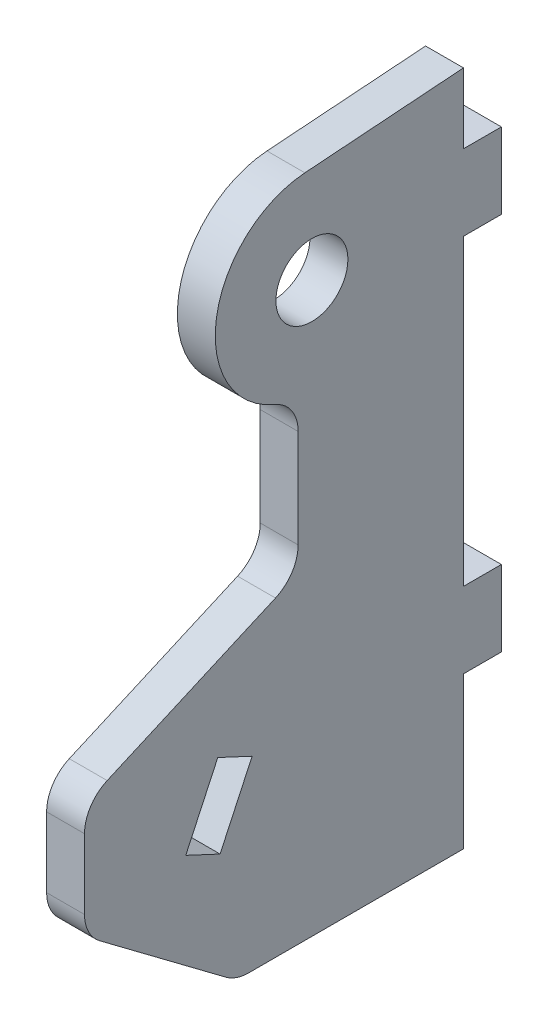
ISO-10303-21;
HEADER;
FILE_DESCRIPTION(('STEP AP214'),'2;1');
FILE_NAME('part.step','',(''),(''),'','','');
FILE_SCHEMA(('AUTOMOTIVE_DESIGN { 1 0 10303 214 1 1 1 1 }'));
ENDSEC;
DATA;
#1=APPLICATION_CONTEXT('core data for automotive mechanical design processes');
#2=APPLICATION_PROTOCOL_DEFINITION('international standard','automotive_design',2000,#1);
#3=PRODUCT_CONTEXT('',#1,'mechanical');
#4=PRODUCT('Part','Part','',(#3));
#5=PRODUCT_RELATED_PRODUCT_CATEGORY('part','',(#4));
#6=PRODUCT_DEFINITION_FORMATION('','',#4);
#7=PRODUCT_DEFINITION_CONTEXT('part definition',#1,'design');
#8=PRODUCT_DEFINITION('design','',#6,#7);
#9=PRODUCT_DEFINITION_SHAPE('','',#8);
#10=(LENGTH_UNIT() NAMED_UNIT(*) SI_UNIT(.MILLI.,.METRE.));
#11=(NAMED_UNIT(*) PLANE_ANGLE_UNIT() SI_UNIT($,.RADIAN.));
#12=(NAMED_UNIT(*) SI_UNIT($,.STERADIAN.) SOLID_ANGLE_UNIT());
#13=UNCERTAINTY_MEASURE_WITH_UNIT(LENGTH_MEASURE(1.E-05),#10,'distance_accuracy_value','');
#14=(GEOMETRIC_REPRESENTATION_CONTEXT(3) GLOBAL_UNCERTAINTY_ASSIGNED_CONTEXT((#13)) GLOBAL_UNIT_ASSIGNED_CONTEXT((#10,
#11,#12)) REPRESENTATION_CONTEXT('',''));
#15=CARTESIAN_POINT('',(0.,0.,0.));
#16=DIRECTION('',(0.,0.,1.));
#17=DIRECTION('',(1.,0.,0.));
#18=AXIS2_PLACEMENT_3D('',#15,#16,#17);
#19=CARTESIAN_POINT('',(2.5,-15.7577175116872,0.));
#20=DIRECTION('',(0.,0.,1.));
#21=DIRECTION('',(1.,0.,0.));
#22=AXIS2_PLACEMENT_3D('',#19,#20,#21);
#23=PLANE('',#22);
#24=DIRECTION('',(-1.,0.,0.));
#25=VECTOR('',#24,1.);
#26=CARTESIAN_POINT('',(0.,-55.,0.));
#27=LINE('',#26,#25);
#28=CARTESIAN_POINT('',(2.5,-55.,0.));
#29=VERTEX_POINT('',#28);
#30=CARTESIAN_POINT('',(-2.5,-55.,0.));
#31=VERTEX_POINT('',#30);
#32=EDGE_CURVE('E66',#29,#31,#27,.T.);
#33=ORIENTED_EDGE('',*,*,#32,.F.);
#34=DIRECTION('',(0.,1.,0.));
#35=VECTOR('',#34,1.);
#36=CARTESIAN_POINT('',(2.5,-74.9977175116872,0.));
#37=LINE('',#36,#35);
#38=CARTESIAN_POINT('',(2.5,-74.9977175116872,0.));
#39=VERTEX_POINT('',#38);
#40=EDGE_CURVE('E308',#39,#29,#37,.T.);
#41=ORIENTED_EDGE('',*,*,#40,.F.);
#42=DIRECTION('',(-1.,0.,0.));
#43=VECTOR('',#42,1.);
#44=CARTESIAN_POINT('',(2.5,-74.9977175116872,0.));
#45=LINE('',#44,#43);
#46=CARTESIAN_POINT('',(-2.5,-74.9977175116872,0.));
#47=VERTEX_POINT('',#46);
#48=EDGE_CURVE('E357',#39,#47,#45,.T.);
#49=ORIENTED_EDGE('',*,*,#48,.T.);
#50=DIRECTION('',(0.,1.,0.));
#51=VECTOR('',#50,1.);
#52=CARTESIAN_POINT('',(-2.5,-15.7577175116872,0.));
#53=LINE('',#52,#51);
#54=EDGE_CURVE('E339',#47,#31,#53,.T.);
#55=ORIENTED_EDGE('',*,*,#54,.T.);
#56=EDGE_LOOP('',(#33,#41,#49,#55));
#57=FACE_BOUND('',#56,.T.);
#58=ADVANCED_FACE('F43',(#57),#23,.F.);
#59=CARTESIAN_POINT('',(2.5,0.,20.));
#60=DIRECTION('',(1.,0.,0.));
#61=DIRECTION('',(0.,0.,-1.));
#62=AXIS2_PLACEMENT_3D('',#59,#60,#61);
#63=PLANE('',#62);
#64=DIRECTION('',(0.,0.422618261740701,0.90630778703665));
#65=VECTOR('',#64,1.);
#66=CARTESIAN_POINT('',(2.5,-50.4661785765039,27.8869086912965));
#67=LINE('',#66,#65);
#68=CARTESIAN_POINT('',(2.5,-50.4661785765039,27.8869086912965));
#69=VERTEX_POINT('',#68);
#70=CARTESIAN_POINT('',(2.5,-48.3530872678004,32.4184476264797));
#71=VERTEX_POINT('',#70);
#72=EDGE_CURVE('E256',#69,#71,#67,.T.);
#73=ORIENTED_EDGE('',*,*,#72,.F.);
#74=DIRECTION('',(0.,-0.90630778703665,0.4226182617407));
#75=VECTOR('',#74,1.);
#76=CARTESIAN_POINT('',(2.5,-50.4661785765039,27.8869086912965));
#77=LINE('',#76,#75);
#78=CARTESIAN_POINT('',(2.5,-59.5292564468704,32.1130913087035));
#79=VERTEX_POINT('',#78);
#80=EDGE_CURVE('E264',#69,#79,#77,.T.);
#81=ORIENTED_EDGE('',*,*,#80,.T.);
#82=DIRECTION('',(0.,0.4226182617407,0.90630778703665));
#83=VECTOR('',#82,1.);
#84=CARTESIAN_POINT('',(2.5,-59.5292564468704,32.1130913087035));
#85=LINE('',#84,#83);
#86=CARTESIAN_POINT('',(2.5,-57.4161651381669,36.6446302438868));
#87=VERTEX_POINT('',#86);
#88=EDGE_CURVE('E261',#79,#87,#85,.T.);
#89=ORIENTED_EDGE('',*,*,#88,.T.);
#90=DIRECTION('',(0.,-0.90630778703665,0.422618261740701));
#91=VECTOR('',#90,1.);
#92=CARTESIAN_POINT('',(2.5,-48.3530872678004,32.4184476264797));
#93=LINE('',#92,#91);
#94=EDGE_CURVE('E258',#71,#87,#93,.T.);
#95=ORIENTED_EDGE('',*,*,#94,.F.);
#96=EDGE_LOOP('',(#73,#81,#89,#95));
#97=FACE_BOUND('',#96,.T.);
#98=DIRECTION('',(0.,-0.6,-0.8));
#99=VECTOR('',#98,1.);
#100=CARTESIAN_POINT('',(2.5,-74.9977175116872,30.));
#101=LINE('',#100,#99);
#102=CARTESIAN_POINT('',(2.5,-61.4977175116872,48.));
#103=VERTEX_POINT('',#102);
#104=CARTESIAN_POINT('',(2.5,-73.9977175116872,31.3333333333333));
#105=VERTEX_POINT('',#104);
#106=EDGE_CURVE('E304',#103,#105,#101,.T.);
#107=ORIENTED_EDGE('',*,*,#106,.T.);
#108=CARTESIAN_POINT('',(2.5,-69.9977175116872,28.3333333333333));
#109=DIRECTION('',(1.,0.,0.));
#110=DIRECTION('',(0.,0.,-1.));
#111=AXIS2_PLACEMENT_3D('',#108,#109,#110);
#112=CIRCLE('',#111,5.);
#113=CARTESIAN_POINT('',(2.5,-74.9977175116872,28.3333333333333));
#114=VERTEX_POINT('',#113);
#115=EDGE_CURVE('E396',#105,#114,#112,.T.);
#116=ORIENTED_EDGE('',*,*,#115,.T.);
#117=DIRECTION('',(0.,0.,-1.));
#118=VECTOR('',#117,1.);
#119=CARTESIAN_POINT('',(2.5,-74.9977175116872,30.));
#120=LINE('',#119,#118);
#121=EDGE_CURVE('E306',#114,#39,#120,.T.);
#122=ORIENTED_EDGE('',*,*,#121,.T.);
#123=ORIENTED_EDGE('',*,*,#40,.T.);
#124=DIRECTION('',(0.,0.,1.));
#125=VECTOR('',#124,1.);
#126=CARTESIAN_POINT('',(2.5,-55.,-5.));
#127=LINE('',#126,#125);
#128=CARTESIAN_POINT('',(2.5,-55.,-5.));
#129=VERTEX_POINT('',#128);
#130=EDGE_CURVE('E220',#129,#29,#127,.T.);
#131=ORIENTED_EDGE('',*,*,#130,.F.);
#132=DIRECTION('',(0.,-1.,0.));
#133=VECTOR('',#132,1.);
#134=CARTESIAN_POINT('',(2.5,0.,-5.));
#135=LINE('',#134,#133);
#136=CARTESIAN_POINT('',(2.5,-45.,-5.));
#137=VERTEX_POINT('',#136);
#138=EDGE_CURVE('E223',#137,#129,#135,.T.);
#139=ORIENTED_EDGE('',*,*,#138,.F.);
#140=DIRECTION('',(0.,0.,1.));
#141=VECTOR('',#140,1.);
#142=CARTESIAN_POINT('',(2.5,-45.,-5.));
#143=LINE('',#142,#141);
#144=CARTESIAN_POINT('',(2.5,-45.,0.));
#145=VERTEX_POINT('',#144);
#146=EDGE_CURVE('E211',#137,#145,#143,.T.);
#147=ORIENTED_EDGE('',*,*,#146,.T.);
#148=CARTESIAN_POINT('',(2.5,-5.,0.));
#149=VERTEX_POINT('',#148);
#150=EDGE_CURVE('E58',#145,#149,#37,.T.);
#151=ORIENTED_EDGE('',*,*,#150,.T.);
#152=DIRECTION('',(0.,0.,-1.));
#153=VECTOR('',#152,1.);
#154=CARTESIAN_POINT('',(2.5,-5.,-5.));
#155=LINE('',#154,#153);
#156=CARTESIAN_POINT('',(2.5,-5.,-5.));
#157=VERTEX_POINT('',#156);
#158=EDGE_CURVE('E310',#149,#157,#155,.T.);
#159=ORIENTED_EDGE('',*,*,#158,.T.);
#160=DIRECTION('',(0.,1.,0.));
#161=VECTOR('',#160,1.);
#162=CARTESIAN_POINT('',(2.5,5.,-5.));
#163=LINE('',#162,#161);
#164=CARTESIAN_POINT('',(2.5,5.,-5.));
#165=VERTEX_POINT('',#164);
#166=EDGE_CURVE('E312',#157,#165,#163,.T.);
#167=ORIENTED_EDGE('',*,*,#166,.T.);
#168=DIRECTION('',(0.,0.,1.));
#169=VECTOR('',#168,1.);
#170=CARTESIAN_POINT('',(2.5,5.,-5.));
#171=LINE('',#170,#169);
#172=CARTESIAN_POINT('',(2.5,5.,0.));
#173=VERTEX_POINT('',#172);
#174=EDGE_CURVE('E314',#165,#173,#171,.T.);
#175=ORIENTED_EDGE('',*,*,#174,.T.);
#176=DIRECTION('',(0.,1.,0.));
#177=VECTOR('',#176,1.);
#178=CARTESIAN_POINT('',(2.5,5.,0.));
#179=LINE('',#178,#177);
#180=CARTESIAN_POINT('',(2.5,14.2422824883128,0.));
#181=VERTEX_POINT('',#180);
#182=EDGE_CURVE('E286',#173,#181,#179,.T.);
#183=ORIENTED_EDGE('',*,*,#182,.T.);
#184=DIRECTION('',(0.,-0.0727282972971378,0.997351790880359));
#185=VECTOR('',#184,1.);
#186=CARTESIAN_POINT('',(2.5,14.2422824883128,0.));
#187=LINE('',#186,#185);
#188=CARTESIAN_POINT('',(2.5,12.7162353337246,20.9272857905385));
#189=VERTEX_POINT('',#188);
#190=EDGE_CURVE('E289',#181,#189,#187,.T.);
#191=ORIENTED_EDGE('',*,*,#190,.T.);
#192=CARTESIAN_POINT('',(2.5,0.,20.));
#193=DIRECTION('',(1.,0.,0.));
#194=DIRECTION('',(0.,0.,-1.));
#195=AXIS2_PLACEMENT_3D('',#192,#193,#194);
#196=CIRCLE('',#195,12.75);
#197=CARTESIAN_POINT('',(2.5,-11.7727645964355,24.8953563462647));
#198=VERTEX_POINT('',#197);
#199=EDGE_CURVE('E292',#189,#198,#196,.T.);
#200=ORIENTED_EDGE('',*,*,#199,.T.);
#201=CARTESIAN_POINT('',(2.5,-16.3895350264103,26.8151039330352));
#202=DIRECTION('',(1.,0.,0.));
#203=DIRECTION('',(0.,0.,-1.));
#204=AXIS2_PLACEMENT_3D('',#201,#202,#203);
#205=CIRCLE('',#204,5.);
#206=CARTESIAN_POINT('',(2.5,-16.3895350264103,21.8151039330352));
#207=VERTEX_POINT('',#206);
#208=EDGE_CURVE('E405',#198,#207,#205,.F.);
#209=ORIENTED_EDGE('',*,*,#208,.T.);
#210=DIRECTION('',(0.,-1.,0.));
#211=VECTOR('',#210,1.);
#212=CARTESIAN_POINT('',(2.5,-32.6201385773802,21.8151039330352));
#213=LINE('',#212,#211);
#214=CARTESIAN_POINT('',(2.5,-29.3550180036596,21.8151039330352));
#215=VERTEX_POINT('',#214);
#216=EDGE_CURVE('E295',#207,#215,#213,.T.);
#217=ORIENTED_EDGE('',*,*,#216,.T.);
#218=CARTESIAN_POINT('',(2.5,-29.3550180036596,26.8151039330352));
#219=DIRECTION('',(1.,0.,0.));
#220=DIRECTION('',(0.,0.,-1.));
#221=AXIS2_PLACEMENT_3D('',#218,#219,#220);
#222=CIRCLE('',#221,5.);
#223=CARTESIAN_POINT('',(2.5,-33.9330155948013,24.8046467572913));
#224=VERTEX_POINT('',#223);
#225=EDGE_CURVE('E11',#215,#224,#222,.F.);
#226=ORIENTED_EDGE('',*,*,#225,.T.);
#227=DIRECTION('',(0.,-0.402091435148774,0.915599518228357));
#228=VECTOR('',#227,1.);
#229=CARTESIAN_POINT('',(2.5,-44.9977175116872,50.));
#230=LINE('',#229,#228);
#231=CARTESIAN_POINT('',(2.5,-43.6848404942661,47.0104571757439));
#232=VERTEX_POINT('',#231);
#233=EDGE_CURVE('E298',#224,#232,#230,.T.);
#234=ORIENTED_EDGE('',*,*,#233,.T.);
#235=CARTESIAN_POINT('',(2.5,-48.2628380854079,45.));
#236=DIRECTION('',(1.,0.,0.));
#237=DIRECTION('',(0.,0.,-1.));
#238=AXIS2_PLACEMENT_3D('',#235,#236,#237);
#239=CIRCLE('',#238,5.);
#240=CARTESIAN_POINT('',(2.5,-48.2628380854079,50.));
#241=VERTEX_POINT('',#240);
#242=EDGE_CURVE('E392',#232,#241,#239,.T.);
#243=ORIENTED_EDGE('',*,*,#242,.T.);
#244=DIRECTION('',(0.,-1.,0.));
#245=VECTOR('',#244,1.);
#246=CARTESIAN_POINT('',(2.5,-59.9977175116872,50.));
#247=LINE('',#246,#245);
#248=CARTESIAN_POINT('',(2.5,-57.4977175116872,50.));
#249=VERTEX_POINT('',#248);
#250=EDGE_CURVE('E301',#241,#249,#247,.T.);
#251=ORIENTED_EDGE('',*,*,#250,.T.);
#252=CARTESIAN_POINT('',(2.5,-57.4977175116872,45.));
#253=DIRECTION('',(1.,0.,0.));
#254=DIRECTION('',(0.,0.,-1.));
#255=AXIS2_PLACEMENT_3D('',#252,#253,#254);
#256=CIRCLE('',#255,5.);
#257=EDGE_CURVE('E394',#249,#103,#256,.T.);
#258=ORIENTED_EDGE('',*,*,#257,.T.);
#259=EDGE_LOOP('',(#107,#116,#122,#123,#131,#139,#147,#151,#159,#167,#175,#183,#191,#200,#209,
#217,#226,#234,#243,#251,#258));
#260=FACE_BOUND('',#259,.T.);
#261=CARTESIAN_POINT('',(2.5,0.,20.));
#262=DIRECTION('',(1.,0.,0.));
#263=DIRECTION('',(0.,0.,-1.));
#264=AXIS2_PLACEMENT_3D('',#261,#262,#263);
#265=CIRCLE('',#264,4.75);
#266=CARTESIAN_POINT('',(2.5,0.,15.25));
#267=VERTEX_POINT('',#266);
#268=EDGE_CURVE('E280',#267,#267,#265,.T.);
#269=ORIENTED_EDGE('',*,*,#268,.F.);
#270=EDGE_LOOP('',(#269));
#271=FACE_BOUND('',#270,.T.);
#272=ADVANCED_FACE('F225',(#97,#260,#271),#63,.T.);
#273=CARTESIAN_POINT('',(-2.5,0.,20.));
#274=DIRECTION('',(1.,0.,0.));
#275=DIRECTION('',(0.,0.,-1.));
#276=AXIS2_PLACEMENT_3D('',#273,#274,#275);
#277=PLANE('',#276);
#278=DIRECTION('',(0.,0.90630778703665,-0.4226182617407));
#279=VECTOR('',#278,1.);
#280=CARTESIAN_POINT('',(-2.5,-50.4661785765039,27.8869086912965));
#281=LINE('',#280,#279);
#282=CARTESIAN_POINT('',(-2.5,-59.5292564468704,32.1130913087035));
#283=VERTEX_POINT('',#282);
#284=CARTESIAN_POINT('',(-2.5,-50.4661785765039,27.8869086912965));
#285=VERTEX_POINT('',#284);
#286=EDGE_CURVE('E250',#283,#285,#281,.T.);
#287=ORIENTED_EDGE('',*,*,#286,.T.);
#288=DIRECTION('',(0.,-0.422618261740701,-0.90630778703665));
#289=VECTOR('',#288,1.);
#290=CARTESIAN_POINT('',(-2.5,-50.4661785765039,27.8869086912965));
#291=LINE('',#290,#289);
#292=CARTESIAN_POINT('',(-2.5,-48.3530872678004,32.4184476264797));
#293=VERTEX_POINT('',#292);
#294=EDGE_CURVE('E253',#293,#285,#291,.T.);
#295=ORIENTED_EDGE('',*,*,#294,.F.);
#296=DIRECTION('',(0.,0.90630778703665,-0.422618261740701));
#297=VECTOR('',#296,1.);
#298=CARTESIAN_POINT('',(-2.5,-48.3530872678004,32.4184476264797));
#299=LINE('',#298,#297);
#300=CARTESIAN_POINT('',(-2.5,-57.4161651381669,36.6446302438868));
#301=VERTEX_POINT('',#300);
#302=EDGE_CURVE('E270',#301,#293,#299,.T.);
#303=ORIENTED_EDGE('',*,*,#302,.F.);
#304=DIRECTION('',(0.,-0.4226182617407,-0.90630778703665));
#305=VECTOR('',#304,1.);
#306=CARTESIAN_POINT('',(-2.5,-59.5292564468704,32.1130913087035));
#307=LINE('',#306,#305);
#308=EDGE_CURVE('E219',#301,#283,#307,.T.);
#309=ORIENTED_EDGE('',*,*,#308,.T.);
#310=EDGE_LOOP('',(#287,#295,#303,#309));
#311=FACE_BOUND('',#310,.T.);
#312=DIRECTION('',(0.,0.,-1.));
#313=VECTOR('',#312,1.);
#314=CARTESIAN_POINT('',(-2.5,-74.9977175116872,30.));
#315=LINE('',#314,#313);
#316=CARTESIAN_POINT('',(-2.5,-74.9977175116872,28.3333333333333));
#317=VERTEX_POINT('',#316);
#318=EDGE_CURVE('E336',#317,#47,#315,.T.);
#319=ORIENTED_EDGE('',*,*,#318,.F.);
#320=CARTESIAN_POINT('',(-2.5,-69.9977175116872,28.3333333333333));
#321=DIRECTION('',(1.,0.,0.));
#322=DIRECTION('',(0.,0.,-1.));
#323=AXIS2_PLACEMENT_3D('',#320,#321,#322);
#324=CIRCLE('',#323,5.);
#325=CARTESIAN_POINT('',(-2.5,-73.9977175116872,31.3333333333333));
#326=VERTEX_POINT('',#325);
#327=EDGE_CURVE('E385',#317,#326,#324,.F.);
#328=ORIENTED_EDGE('',*,*,#327,.T.);
#329=DIRECTION('',(0.,-0.6,-0.8));
#330=VECTOR('',#329,1.);
#331=CARTESIAN_POINT('',(-2.5,-74.9977175116872,30.));
#332=LINE('',#331,#330);
#333=CARTESIAN_POINT('',(-2.5,-61.4977175116872,48.));
#334=VERTEX_POINT('',#333);
#335=EDGE_CURVE('E333',#334,#326,#332,.T.);
#336=ORIENTED_EDGE('',*,*,#335,.F.);
#337=CARTESIAN_POINT('',(-2.5,-57.4977175116872,45.));
#338=DIRECTION('',(1.,0.,0.));
#339=DIRECTION('',(0.,0.,-1.));
#340=AXIS2_PLACEMENT_3D('',#337,#338,#339);
#341=CIRCLE('',#340,5.);
#342=CARTESIAN_POINT('',(-2.5,-57.4977175116872,50.));
#343=VERTEX_POINT('',#342);
#344=EDGE_CURVE('E383',#334,#343,#341,.F.);
#345=ORIENTED_EDGE('',*,*,#344,.T.);
#346=DIRECTION('',(0.,-1.,0.));
#347=VECTOR('',#346,1.);
#348=CARTESIAN_POINT('',(-2.5,-59.9977175116872,50.));
#349=LINE('',#348,#347);
#350=CARTESIAN_POINT('',(-2.5,-48.2628380854079,50.));
#351=VERTEX_POINT('',#350);
#352=EDGE_CURVE('E330',#351,#343,#349,.T.);
#353=ORIENTED_EDGE('',*,*,#352,.F.);
#354=CARTESIAN_POINT('',(-2.5,-48.2628380854079,45.));
#355=DIRECTION('',(1.,0.,0.));
#356=DIRECTION('',(0.,0.,-1.));
#357=AXIS2_PLACEMENT_3D('',#354,#355,#356);
#358=CIRCLE('',#357,5.);
#359=CARTESIAN_POINT('',(-2.5,-43.6848404942661,47.0104571757439));
#360=VERTEX_POINT('',#359);
#361=EDGE_CURVE('E381',#351,#360,#358,.F.);
#362=ORIENTED_EDGE('',*,*,#361,.T.);
#363=DIRECTION('',(0.,-0.402091435148774,0.915599518228357));
#364=VECTOR('',#363,1.);
#365=CARTESIAN_POINT('',(-2.5,-44.9977175116872,50.));
#366=LINE('',#365,#364);
#367=CARTESIAN_POINT('',(-2.5,-33.9330155948013,24.8046467572913));
#368=VERTEX_POINT('',#367);
#369=EDGE_CURVE('E327',#368,#360,#366,.T.);
#370=ORIENTED_EDGE('',*,*,#369,.F.);
#371=CARTESIAN_POINT('',(-2.5,-29.3550180036596,26.8151039330352));
#372=DIRECTION('',(1.,0.,0.));
#373=DIRECTION('',(0.,0.,-1.));
#374=AXIS2_PLACEMENT_3D('',#371,#372,#373);
#375=CIRCLE('',#374,5.);
#376=CARTESIAN_POINT('',(-2.5,-29.3550180036596,21.8151039330352));
#377=VERTEX_POINT('',#376);
#378=EDGE_CURVE('E51',#368,#377,#375,.T.);
#379=ORIENTED_EDGE('',*,*,#378,.T.);
#380=DIRECTION('',(0.,-1.,0.));
#381=VECTOR('',#380,1.);
#382=CARTESIAN_POINT('',(-2.5,-32.6201385773802,21.8151039330352));
#383=LINE('',#382,#381);
#384=CARTESIAN_POINT('',(-2.5,-16.3895350264103,21.8151039330352));
#385=VERTEX_POINT('',#384);
#386=EDGE_CURVE('E324',#385,#377,#383,.T.);
#387=ORIENTED_EDGE('',*,*,#386,.F.);
#388=CARTESIAN_POINT('',(-2.5,-16.3895350264103,26.8151039330352));
#389=DIRECTION('',(1.,0.,0.));
#390=DIRECTION('',(0.,0.,-1.));
#391=AXIS2_PLACEMENT_3D('',#388,#389,#390);
#392=CIRCLE('',#391,5.);
#393=CARTESIAN_POINT('',(-2.5,-11.7727645964355,24.8953563462647));
#394=VERTEX_POINT('',#393);
#395=EDGE_CURVE('E403',#385,#394,#392,.T.);
#396=ORIENTED_EDGE('',*,*,#395,.T.);
#397=CARTESIAN_POINT('',(-2.5,0.,20.));
#398=DIRECTION('',(1.,0.,0.));
#399=DIRECTION('',(0.,0.,-1.));
#400=AXIS2_PLACEMENT_3D('',#397,#398,#399);
#401=CIRCLE('',#400,12.75);
#402=CARTESIAN_POINT('',(-2.5,12.7162353337246,20.9272857905385));
#403=VERTEX_POINT('',#402);
#404=EDGE_CURVE('E321',#403,#394,#401,.T.);
#405=ORIENTED_EDGE('',*,*,#404,.F.);
#406=DIRECTION('',(0.,-0.0727282972971378,0.997351790880359));
#407=VECTOR('',#406,1.);
#408=CARTESIAN_POINT('',(-2.5,14.2422824883128,0.));
#409=LINE('',#408,#407);
#410=CARTESIAN_POINT('',(-2.5,14.2422824883128,0.));
#411=VERTEX_POINT('',#410);
#412=EDGE_CURVE('E319',#411,#403,#409,.T.);
#413=ORIENTED_EDGE('',*,*,#412,.F.);
#414=DIRECTION('',(0.,1.,0.));
#415=VECTOR('',#414,1.);
#416=CARTESIAN_POINT('',(-2.5,5.,0.));
#417=LINE('',#416,#415);
#418=CARTESIAN_POINT('',(-2.5,5.,0.));
#419=VERTEX_POINT('',#418);
#420=EDGE_CURVE('E283',#419,#411,#417,.T.);
#421=ORIENTED_EDGE('',*,*,#420,.F.);
#422=DIRECTION('',(0.,0.,1.));
#423=VECTOR('',#422,1.);
#424=CARTESIAN_POINT('',(-2.5,5.,-5.));
#425=LINE('',#424,#423);
#426=CARTESIAN_POINT('',(-2.5,5.,-5.));
#427=VERTEX_POINT('',#426);
#428=EDGE_CURVE('E290',#427,#419,#425,.T.);
#429=ORIENTED_EDGE('',*,*,#428,.F.);
#430=DIRECTION('',(0.,1.,0.));
#431=VECTOR('',#430,1.);
#432=CARTESIAN_POINT('',(-2.5,5.,-5.));
#433=LINE('',#432,#431);
#434=CARTESIAN_POINT('',(-2.5,-5.,-5.));
#435=VERTEX_POINT('',#434);
#436=EDGE_CURVE('E343',#435,#427,#433,.T.);
#437=ORIENTED_EDGE('',*,*,#436,.F.);
#438=DIRECTION('',(0.,0.,-1.));
#439=VECTOR('',#438,1.);
#440=CARTESIAN_POINT('',(-2.5,-5.,-5.));
#441=LINE('',#440,#439);
#442=CARTESIAN_POINT('',(-2.5,-5.,0.));
#443=VERTEX_POINT('',#442);
#444=EDGE_CURVE('E341',#443,#435,#441,.T.);
#445=ORIENTED_EDGE('',*,*,#444,.F.);
#446=CARTESIAN_POINT('',(-2.5,-45.,0.));
#447=VERTEX_POINT('',#446);
#448=EDGE_CURVE('E338',#447,#443,#53,.T.);
#449=ORIENTED_EDGE('',*,*,#448,.F.);
#450=DIRECTION('',(0.,0.,1.));
#451=VECTOR('',#450,1.);
#452=CARTESIAN_POINT('',(-2.5,-45.,-5.));
#453=LINE('',#452,#451);
#454=CARTESIAN_POINT('',(-2.5,-45.,-5.));
#455=VERTEX_POINT('',#454);
#456=EDGE_CURVE('E241',#455,#447,#453,.T.);
#457=ORIENTED_EDGE('',*,*,#456,.F.);
#458=DIRECTION('',(0.,1.,0.));
#459=VECTOR('',#458,1.);
#460=CARTESIAN_POINT('',(-2.5,0.,-5.));
#461=LINE('',#460,#459);
#462=CARTESIAN_POINT('',(-2.5,-55.,-5.));
#463=VERTEX_POINT('',#462);
#464=EDGE_CURVE('E234',#463,#455,#461,.T.);
#465=ORIENTED_EDGE('',*,*,#464,.F.);
#466=DIRECTION('',(0.,0.,1.));
#467=VECTOR('',#466,1.);
#468=CARTESIAN_POINT('',(-2.5,-55.,-5.));
#469=LINE('',#468,#467);
#470=EDGE_CURVE('E244',#463,#31,#469,.T.);
#471=ORIENTED_EDGE('',*,*,#470,.T.);
#472=ORIENTED_EDGE('',*,*,#54,.F.);
#473=EDGE_LOOP('',(#319,#328,#336,#345,#353,#362,#370,#379,#387,#396,#405,#413,#421,#429,#437,
#445,#449,#457,#465,#471,#472));
#474=FACE_BOUND('',#473,.T.);
#475=CARTESIAN_POINT('',(-2.5,0.,20.));
#476=DIRECTION('',(1.,0.,0.));
#477=DIRECTION('',(0.,0.,-1.));
#478=AXIS2_PLACEMENT_3D('',#475,#476,#477);
#479=CIRCLE('',#478,4.75);
#480=CARTESIAN_POINT('',(-2.5,0.,15.25));
#481=VERTEX_POINT('',#480);
#482=EDGE_CURVE('E279',#481,#481,#479,.T.);
#483=ORIENTED_EDGE('',*,*,#482,.T.);
#484=EDGE_LOOP('',(#483));
#485=FACE_BOUND('',#484,.T.);
#486=ADVANCED_FACE('F410',(#311,#474,#485),#277,.F.);
#487=CARTESIAN_POINT('',(2.5,5.,0.));
#488=DIRECTION('',(0.,0.,1.));
#489=DIRECTION('',(1.,0.,0.));
#490=AXIS2_PLACEMENT_3D('',#487,#488,#489);
#491=PLANE('',#490);
#492=ORIENTED_EDGE('',*,*,#420,.T.);
#493=DIRECTION('',(-1.,0.,0.));
#494=VECTOR('',#493,1.);
#495=CARTESIAN_POINT('',(2.5,14.2422824883128,0.));
#496=LINE('',#495,#494);
#497=EDGE_CURVE('E363',#181,#411,#496,.T.);
#498=ORIENTED_EDGE('',*,*,#497,.F.);
#499=ORIENTED_EDGE('',*,*,#182,.F.);
#500=DIRECTION('',(-1.,0.,0.));
#501=VECTOR('',#500,1.);
#502=CARTESIAN_POINT('',(2.5,5.,0.));
#503=LINE('',#502,#501);
#504=EDGE_CURVE('E316',#173,#419,#503,.T.);
#505=ORIENTED_EDGE('',*,*,#504,.T.);
#506=EDGE_LOOP('',(#492,#498,#499,#505));
#507=FACE_BOUND('',#506,.T.);
#508=ADVANCED_FACE('F479',(#507),#491,.F.);
#509=CARTESIAN_POINT('',(2.5,14.2422824883128,0.));
#510=DIRECTION('',(0.,-0.997351790880359,-0.0727282972971378));
#511=DIRECTION('',(0.,0.0727282972971378,-0.997351790880359));
#512=AXIS2_PLACEMENT_3D('',#509,#510,#511);
#513=PLANE('',#512);
#514=ORIENTED_EDGE('',*,*,#412,.T.);
#515=DIRECTION('',(-1.,0.,0.));
#516=VECTOR('',#515,1.);
#517=CARTESIAN_POINT('',(2.5,12.7162353337246,20.9272857905385));
#518=LINE('',#517,#516);
#519=EDGE_CURVE('E360',#189,#403,#518,.T.);
#520=ORIENTED_EDGE('',*,*,#519,.F.);
#521=ORIENTED_EDGE('',*,*,#190,.F.);
#522=ORIENTED_EDGE('',*,*,#497,.T.);
#523=EDGE_LOOP('',(#514,#520,#521,#522));
#524=FACE_BOUND('',#523,.T.);
#525=ADVANCED_FACE('F511',(#524),#513,.F.);
#526=CARTESIAN_POINT('',(2.5,0.,20.));
#527=DIRECTION('',(-1.,0.,0.));
#528=DIRECTION('',(0.,0.,1.));
#529=AXIS2_PLACEMENT_3D('',#526,#527,#528);
#530=CYLINDRICAL_SURFACE('',#529,12.75);
#531=ORIENTED_EDGE('',*,*,#404,.T.);
#532=DIRECTION('',(-1.,0.,0.));
#533=VECTOR('',#532,1.);
#534=CARTESIAN_POINT('',(2.5,-11.7727645964355,24.8953563462647));
#535=LINE('',#534,#533);
#536=EDGE_CURVE('E371',#394,#198,#535,.F.);
#537=ORIENTED_EDGE('',*,*,#536,.T.);
#538=ORIENTED_EDGE('',*,*,#199,.F.);
#539=ORIENTED_EDGE('',*,*,#519,.T.);
#540=EDGE_LOOP('',(#531,#537,#538,#539));
#541=FACE_BOUND('',#540,.T.);
#542=ADVANCED_FACE('F513',(#541),#530,.T.);
#543=CARTESIAN_POINT('',(2.5,-32.6201385773802,21.8151039330352));
#544=DIRECTION('',(0.,0.,-1.));
#545=DIRECTION('',(-1.,0.,0.));
#546=AXIS2_PLACEMENT_3D('',#543,#544,#545);
#547=PLANE('',#546);
#548=ORIENTED_EDGE('',*,*,#216,.F.);
#549=DIRECTION('',(1.,0.,0.));
#550=VECTOR('',#549,1.);
#551=CARTESIAN_POINT('',(-2.5,-16.3895350264103,21.8151039330352));
#552=LINE('',#551,#550);
#553=EDGE_CURVE('E368',#207,#385,#552,.F.);
#554=ORIENTED_EDGE('',*,*,#553,.T.);
#555=ORIENTED_EDGE('',*,*,#386,.T.);
#556=DIRECTION('',(-1.,0.,0.));
#557=VECTOR('',#556,1.);
#558=CARTESIAN_POINT('',(2.5,-29.3550180036596,21.8151039330352));
#559=LINE('',#558,#557);
#560=EDGE_CURVE('E366',#377,#215,#559,.F.);
#561=ORIENTED_EDGE('',*,*,#560,.T.);
#562=EDGE_LOOP('',(#548,#554,#555,#561));
#563=FACE_BOUND('',#562,.T.);
#564=ADVANCED_FACE('F417',(#563),#547,.F.);
#565=CARTESIAN_POINT('',(2.5,-44.9977175116872,50.));
#566=DIRECTION('',(0.,-0.915599518228357,-0.402091435148774));
#567=DIRECTION('',(0.,0.402091435148774,-0.915599518228357));
#568=AXIS2_PLACEMENT_3D('',#565,#566,#567);
#569=PLANE('',#568);
#570=ORIENTED_EDGE('',*,*,#233,.F.);
#571=DIRECTION('',(-1.,0.,0.));
#572=VECTOR('',#571,1.);
#573=CARTESIAN_POINT('',(-2.5,-33.9330155948013,24.8046467572913));
#574=LINE('',#573,#572);
#575=EDGE_CURVE('E375',#224,#368,#574,.T.);
#576=ORIENTED_EDGE('',*,*,#575,.T.);
#577=ORIENTED_EDGE('',*,*,#369,.T.);
#578=DIRECTION('',(-1.,0.,0.));
#579=VECTOR('',#578,1.);
#580=CARTESIAN_POINT('',(2.5,-43.6848404942661,47.0104571757439));
#581=LINE('',#580,#579);
#582=EDGE_CURVE('E373',#360,#232,#581,.F.);
#583=ORIENTED_EDGE('',*,*,#582,.T.);
#584=EDGE_LOOP('',(#570,#576,#577,#583));
#585=FACE_BOUND('',#584,.T.);
#586=ADVANCED_FACE('F424',(#585),#569,.F.);
#587=CARTESIAN_POINT('',(2.5,-59.9977175116872,50.));
#588=DIRECTION('',(0.,0.,-1.));
#589=DIRECTION('',(-1.,0.,0.));
#590=AXIS2_PLACEMENT_3D('',#587,#588,#589);
#591=PLANE('',#590);
#592=ORIENTED_EDGE('',*,*,#352,.T.);
#593=DIRECTION('',(-1.,0.,0.));
#594=VECTOR('',#593,1.);
#595=CARTESIAN_POINT('',(2.5,-57.4977175116872,50.));
#596=LINE('',#595,#594);
#597=EDGE_CURVE('E401',#343,#249,#596,.F.);
#598=ORIENTED_EDGE('',*,*,#597,.T.);
#599=ORIENTED_EDGE('',*,*,#250,.F.);
#600=DIRECTION('',(-1.,0.,0.));
#601=VECTOR('',#600,1.);
#602=CARTESIAN_POINT('',(2.5,-48.2628380854079,50.));
#603=LINE('',#602,#601);
#604=EDGE_CURVE('E398',#241,#351,#603,.T.);
#605=ORIENTED_EDGE('',*,*,#604,.T.);
#606=EDGE_LOOP('',(#592,#598,#599,#605));
#607=FACE_BOUND('',#606,.T.);
#608=ADVANCED_FACE('F431',(#607),#591,.F.);
#609=CARTESIAN_POINT('',(2.5,-74.9977175116872,30.));
#610=DIRECTION('',(0.,0.8,-0.6));
#611=DIRECTION('',(0.,0.6,0.8));
#612=AXIS2_PLACEMENT_3D('',#609,#610,#611);
#613=PLANE('',#612);
#614=ORIENTED_EDGE('',*,*,#335,.T.);
#615=DIRECTION('',(-1.,0.,0.));
#616=VECTOR('',#615,1.);
#617=CARTESIAN_POINT('',(2.5,-73.9977175116872,31.3333333333333));
#618=LINE('',#617,#616);
#619=EDGE_CURVE('E390',#326,#105,#618,.F.);
#620=ORIENTED_EDGE('',*,*,#619,.T.);
#621=ORIENTED_EDGE('',*,*,#106,.F.);
#622=DIRECTION('',(-1.,0.,0.));
#623=VECTOR('',#622,1.);
#624=CARTESIAN_POINT('',(2.5,-61.4977175116872,48.));
#625=LINE('',#624,#623);
#626=EDGE_CURVE('E387',#103,#334,#625,.T.);
#627=ORIENTED_EDGE('',*,*,#626,.T.);
#628=EDGE_LOOP('',(#614,#620,#621,#627));
#629=FACE_BOUND('',#628,.T.);
#630=ADVANCED_FACE('F440',(#629),#613,.F.);
#631=CARTESIAN_POINT('',(2.5,-74.9977175116872,30.));
#632=DIRECTION('',(0.,1.,0.));
#633=DIRECTION('',(0.,0.,1.));
#634=AXIS2_PLACEMENT_3D('',#631,#632,#633);
#635=PLANE('',#634);
#636=ORIENTED_EDGE('',*,*,#121,.F.);
#637=DIRECTION('',(-1.,0.,0.));
#638=VECTOR('',#637,1.);
#639=CARTESIAN_POINT('',(2.5,-74.9977175116872,28.3333333333333));
#640=LINE('',#639,#638);
#641=EDGE_CURVE('E378',#114,#317,#640,.T.);
#642=ORIENTED_EDGE('',*,*,#641,.T.);
#643=ORIENTED_EDGE('',*,*,#318,.T.);
#644=ORIENTED_EDGE('',*,*,#48,.F.);
#645=EDGE_LOOP('',(#636,#642,#643,#644));
#646=FACE_BOUND('',#645,.T.);
#647=ADVANCED_FACE('F449',(#646),#635,.F.);
#648=ORIENTED_EDGE('',*,*,#150,.F.);
#649=DIRECTION('',(-1.,0.,0.));
#650=VECTOR('',#649,1.);
#651=CARTESIAN_POINT('',(0.,-45.,0.));
#652=LINE('',#651,#650);
#653=EDGE_CURVE('E217',#145,#447,#652,.T.);
#654=ORIENTED_EDGE('',*,*,#653,.T.);
#655=ORIENTED_EDGE('',*,*,#448,.T.);
#656=DIRECTION('',(-1.,0.,0.));
#657=VECTOR('',#656,1.);
#658=CARTESIAN_POINT('',(2.5,-5.,0.));
#659=LINE('',#658,#657);
#660=EDGE_CURVE('E354',#149,#443,#659,.T.);
#661=ORIENTED_EDGE('',*,*,#660,.F.);
#662=EDGE_LOOP('',(#648,#654,#655,#661));
#663=FACE_BOUND('',#662,.T.);
#664=ADVANCED_FACE('F456',(#663),#23,.F.);
#665=CARTESIAN_POINT('',(2.5,-5.,-5.));
#666=DIRECTION('',(0.,1.,0.));
#667=DIRECTION('',(0.,0.,1.));
#668=AXIS2_PLACEMENT_3D('',#665,#666,#667);
#669=PLANE('',#668);
#670=ORIENTED_EDGE('',*,*,#444,.T.);
#671=DIRECTION('',(-1.,0.,0.));
#672=VECTOR('',#671,1.);
#673=CARTESIAN_POINT('',(2.5,-5.,-5.));
#674=LINE('',#673,#672);
#675=EDGE_CURVE('E351',#157,#435,#674,.T.);
#676=ORIENTED_EDGE('',*,*,#675,.F.);
#677=ORIENTED_EDGE('',*,*,#158,.F.);
#678=ORIENTED_EDGE('',*,*,#660,.T.);
#679=EDGE_LOOP('',(#670,#676,#677,#678));
#680=FACE_BOUND('',#679,.T.);
#681=ADVANCED_FACE('F458',(#680),#669,.F.);
#682=CARTESIAN_POINT('',(2.5,5.,-5.));
#683=DIRECTION('',(0.,0.,1.));
#684=DIRECTION('',(0.,-1.,0.));
#685=AXIS2_PLACEMENT_3D('',#682,#683,#684);
#686=PLANE('',#685);
#687=ORIENTED_EDGE('',*,*,#436,.T.);
#688=DIRECTION('',(-1.,0.,0.));
#689=VECTOR('',#688,1.);
#690=CARTESIAN_POINT('',(2.5,5.,-5.));
#691=LINE('',#690,#689);
#692=EDGE_CURVE('E348',#165,#427,#691,.T.);
#693=ORIENTED_EDGE('',*,*,#692,.F.);
#694=ORIENTED_EDGE('',*,*,#166,.F.);
#695=ORIENTED_EDGE('',*,*,#675,.T.);
#696=EDGE_LOOP('',(#687,#693,#694,#695));
#697=FACE_BOUND('',#696,.T.);
#698=ADVANCED_FACE('F465',(#697),#686,.F.);
#699=CARTESIAN_POINT('',(2.5,5.,-5.));
#700=DIRECTION('',(0.,-1.,0.));
#701=DIRECTION('',(0.,0.,-1.));
#702=AXIS2_PLACEMENT_3D('',#699,#700,#701);
#703=PLANE('',#702);
#704=ORIENTED_EDGE('',*,*,#428,.T.);
#705=ORIENTED_EDGE('',*,*,#504,.F.);
#706=ORIENTED_EDGE('',*,*,#174,.F.);
#707=ORIENTED_EDGE('',*,*,#692,.T.);
#708=EDGE_LOOP('',(#704,#705,#706,#707));
#709=FACE_BOUND('',#708,.T.);
#710=ADVANCED_FACE('F487',(#709),#703,.F.);
#711=CARTESIAN_POINT('',(2.5,0.,20.));
#712=DIRECTION('',(-1.,0.,0.));
#713=DIRECTION('',(0.,0.,1.));
#714=AXIS2_PLACEMENT_3D('',#711,#712,#713);
#715=CYLINDRICAL_SURFACE('',#714,4.75);
#716=ORIENTED_EDGE('',*,*,#268,.T.);
#717=EDGE_LOOP('',(#716));
#718=FACE_BOUND('',#717,.T.);
#719=ORIENTED_EDGE('',*,*,#482,.F.);
#720=EDGE_LOOP('',(#719));
#721=FACE_BOUND('',#720,.T.);
#722=ADVANCED_FACE('F484',(#718,#721),#715,.F.);
#723=CARTESIAN_POINT('',(2.5,-16.3895350264103,26.8151039330352));
#724=DIRECTION('',(-1.,0.,0.));
#725=DIRECTION('',(0.,0.,1.));
#726=AXIS2_PLACEMENT_3D('',#723,#724,#725);
#727=CYLINDRICAL_SURFACE('',#726,5.);
#728=ORIENTED_EDGE('',*,*,#208,.F.);
#729=ORIENTED_EDGE('',*,*,#536,.F.);
#730=ORIENTED_EDGE('',*,*,#395,.F.);
#731=ORIENTED_EDGE('',*,*,#553,.F.);
#732=EDGE_LOOP('',(#728,#729,#730,#731));
#733=FACE_BOUND('',#732,.T.);
#734=ADVANCED_FACE('F516',(#733),#727,.F.);
#735=CARTESIAN_POINT('',(2.5,-29.3550180036596,26.8151039330352));
#736=DIRECTION('',(1.,0.,0.));
#737=DIRECTION('',(0.,0.,-1.));
#738=AXIS2_PLACEMENT_3D('',#735,#736,#737);
#739=CYLINDRICAL_SURFACE('',#738,5.);
#740=ORIENTED_EDGE('',*,*,#225,.F.);
#741=ORIENTED_EDGE('',*,*,#560,.F.);
#742=ORIENTED_EDGE('',*,*,#378,.F.);
#743=ORIENTED_EDGE('',*,*,#575,.F.);
#744=EDGE_LOOP('',(#740,#741,#742,#743));
#745=FACE_BOUND('',#744,.T.);
#746=ADVANCED_FACE('F420',(#745),#739,.F.);
#747=CARTESIAN_POINT('',(2.5,-69.9977175116872,28.3333333333333));
#748=DIRECTION('',(-1.,0.,0.));
#749=DIRECTION('',(0.,0.,1.));
#750=AXIS2_PLACEMENT_3D('',#747,#748,#749);
#751=CYLINDRICAL_SURFACE('',#750,5.);
#752=ORIENTED_EDGE('',*,*,#115,.F.);
#753=ORIENTED_EDGE('',*,*,#619,.F.);
#754=ORIENTED_EDGE('',*,*,#327,.F.);
#755=ORIENTED_EDGE('',*,*,#641,.F.);
#756=EDGE_LOOP('',(#752,#753,#754,#755));
#757=FACE_BOUND('',#756,.T.);
#758=ADVANCED_FACE('F444',(#757),#751,.T.);
#759=CARTESIAN_POINT('',(2.5,-57.4977175116872,45.));
#760=DIRECTION('',(-1.,0.,0.));
#761=DIRECTION('',(0.,0.,1.));
#762=AXIS2_PLACEMENT_3D('',#759,#760,#761);
#763=CYLINDRICAL_SURFACE('',#762,5.);
#764=ORIENTED_EDGE('',*,*,#257,.F.);
#765=ORIENTED_EDGE('',*,*,#597,.F.);
#766=ORIENTED_EDGE('',*,*,#344,.F.);
#767=ORIENTED_EDGE('',*,*,#626,.F.);
#768=EDGE_LOOP('',(#764,#765,#766,#767));
#769=FACE_BOUND('',#768,.T.);
#770=ADVANCED_FACE('F435',(#769),#763,.T.);
#771=CARTESIAN_POINT('',(2.5,-48.2628380854079,45.));
#772=DIRECTION('',(-1.,0.,0.));
#773=DIRECTION('',(0.,0.,1.));
#774=AXIS2_PLACEMENT_3D('',#771,#772,#773);
#775=CYLINDRICAL_SURFACE('',#774,5.);
#776=ORIENTED_EDGE('',*,*,#242,.F.);
#777=ORIENTED_EDGE('',*,*,#582,.F.);
#778=ORIENTED_EDGE('',*,*,#361,.F.);
#779=ORIENTED_EDGE('',*,*,#604,.F.);
#780=EDGE_LOOP('',(#776,#777,#778,#779));
#781=FACE_BOUND('',#780,.T.);
#782=ADVANCED_FACE('F45',(#781),#775,.T.);
#783=CARTESIAN_POINT('',(-2.501,-50.4661785765039,27.8869086912965));
#784=DIRECTION('',(0.,0.906307787036649,-0.4226182617407));
#785=DIRECTION('',(0.,0.422618261740701,0.90630778703665));
#786=AXIS2_PLACEMENT_3D('',#783,#784,#785);
#787=PLANE('',#786);
#788=ORIENTED_EDGE('',*,*,#294,.T.);
#789=DIRECTION('',(1.,0.,0.));
#790=VECTOR('',#789,1.);
#791=CARTESIAN_POINT('',(-2.501,-50.4661785765039,27.8869086912965));
#792=LINE('',#791,#790);
#793=EDGE_CURVE('E268',#285,#69,#792,.T.);
#794=ORIENTED_EDGE('',*,*,#793,.T.);
#795=ORIENTED_EDGE('',*,*,#72,.T.);
#796=DIRECTION('',(1.,0.,0.));
#797=VECTOR('',#796,1.);
#798=CARTESIAN_POINT('',(-2.501,-48.3530872678004,32.4184476264797));
#799=LINE('',#798,#797);
#800=EDGE_CURVE('E267',#293,#71,#799,.T.);
#801=ORIENTED_EDGE('',*,*,#800,.F.);
#802=EDGE_LOOP('',(#788,#794,#795,#801));
#803=FACE_BOUND('',#802,.T.);
#804=ADVANCED_FACE('F533',(#803),#787,.F.);
#805=CARTESIAN_POINT('',(-2.501,-50.4661785765039,27.8869086912965));
#806=DIRECTION('',(0.,0.4226182617407,0.90630778703665));
#807=DIRECTION('',(0.,-0.90630778703665,0.4226182617407));
#808=AXIS2_PLACEMENT_3D('',#805,#806,#807);
#809=PLANE('',#808);
#810=DIRECTION('',(1.,0.,0.));
#811=VECTOR('',#810,1.);
#812=CARTESIAN_POINT('',(-2.501,-59.5292564468704,32.1130913087035));
#813=LINE('',#812,#811);
#814=EDGE_CURVE('E271',#283,#79,#813,.T.);
#815=ORIENTED_EDGE('',*,*,#814,.T.);
#816=ORIENTED_EDGE('',*,*,#80,.F.);
#817=ORIENTED_EDGE('',*,*,#793,.F.);
#818=ORIENTED_EDGE('',*,*,#286,.F.);
#819=EDGE_LOOP('',(#815,#816,#817,#818));
#820=FACE_BOUND('',#819,.T.);
#821=ADVANCED_FACE('F537',(#820),#809,.T.);
#822=CARTESIAN_POINT('',(-2.501,-59.5292564468704,32.1130913087035));
#823=DIRECTION('',(0.,0.90630778703665,-0.4226182617407));
#824=DIRECTION('',(0.,0.4226182617407,0.90630778703665));
#825=AXIS2_PLACEMENT_3D('',#822,#823,#824);
#826=PLANE('',#825);
#827=DIRECTION('',(1.,0.,0.));
#828=VECTOR('',#827,1.);
#829=CARTESIAN_POINT('',(-2.501,-57.4161651381669,36.6446302438868));
#830=LINE('',#829,#828);
#831=EDGE_CURVE('E273',#301,#87,#830,.T.);
#832=ORIENTED_EDGE('',*,*,#831,.T.);
#833=ORIENTED_EDGE('',*,*,#88,.F.);
#834=ORIENTED_EDGE('',*,*,#814,.F.);
#835=ORIENTED_EDGE('',*,*,#308,.F.);
#836=EDGE_LOOP('',(#832,#833,#834,#835));
#837=FACE_BOUND('',#836,.T.);
#838=ADVANCED_FACE('F542',(#837),#826,.T.);
#839=CARTESIAN_POINT('',(-2.501,-48.3530872678004,32.4184476264797));
#840=DIRECTION('',(0.,0.4226182617407,0.906307787036649));
#841=DIRECTION('',(0.,-0.90630778703665,0.422618261740701));
#842=AXIS2_PLACEMENT_3D('',#839,#840,#841);
#843=PLANE('',#842);
#844=ORIENTED_EDGE('',*,*,#302,.T.);
#845=ORIENTED_EDGE('',*,*,#800,.T.);
#846=ORIENTED_EDGE('',*,*,#94,.T.);
#847=ORIENTED_EDGE('',*,*,#831,.F.);
#848=EDGE_LOOP('',(#844,#845,#846,#847));
#849=FACE_BOUND('',#848,.T.);
#850=ADVANCED_FACE('F546',(#849),#843,.F.);
#851=CARTESIAN_POINT('',(0.,-45.,-5.));
#852=DIRECTION('',(0.,1.,0.));
#853=DIRECTION('',(0.,0.,1.));
#854=AXIS2_PLACEMENT_3D('',#851,#852,#853);
#855=PLANE('',#854);
#856=ORIENTED_EDGE('',*,*,#653,.F.);
#857=ORIENTED_EDGE('',*,*,#146,.F.);
#858=DIRECTION('',(-1.,0.,0.));
#859=VECTOR('',#858,1.);
#860=CARTESIAN_POINT('',(0.,-45.,-5.));
#861=LINE('',#860,#859);
#862=EDGE_CURVE('E216',#137,#455,#861,.T.);
#863=ORIENTED_EDGE('',*,*,#862,.T.);
#864=ORIENTED_EDGE('',*,*,#456,.T.);
#865=EDGE_LOOP('',(#856,#857,#863,#864));
#866=FACE_BOUND('',#865,.T.);
#867=ADVANCED_FACE('F213',(#866),#855,.T.);
#868=CARTESIAN_POINT('',(0.,-55.,-5.));
#869=DIRECTION('',(0.,1.,0.));
#870=DIRECTION('',(0.,0.,1.));
#871=AXIS2_PLACEMENT_3D('',#868,#869,#870);
#872=PLANE('',#871);
#873=ORIENTED_EDGE('',*,*,#32,.T.);
#874=ORIENTED_EDGE('',*,*,#470,.F.);
#875=DIRECTION('',(-1.,0.,0.));
#876=VECTOR('',#875,1.);
#877=CARTESIAN_POINT('',(0.,-55.,-5.));
#878=LINE('',#877,#876);
#879=EDGE_CURVE('E230',#129,#463,#878,.T.);
#880=ORIENTED_EDGE('',*,*,#879,.F.);
#881=ORIENTED_EDGE('',*,*,#130,.T.);
#882=EDGE_LOOP('',(#873,#874,#880,#881));
#883=FACE_BOUND('',#882,.T.);
#884=ADVANCED_FACE('F452',(#883),#872,.F.);
#885=CARTESIAN_POINT('',(0.,0.,-5.));
#886=DIRECTION('',(0.,0.,-1.));
#887=DIRECTION('',(-1.,0.,0.));
#888=AXIS2_PLACEMENT_3D('',#885,#886,#887);
#889=PLANE('',#888);
#890=ORIENTED_EDGE('',*,*,#862,.F.);
#891=ORIENTED_EDGE('',*,*,#138,.T.);
#892=ORIENTED_EDGE('',*,*,#879,.T.);
#893=ORIENTED_EDGE('',*,*,#464,.T.);
#894=EDGE_LOOP('',(#890,#891,#892,#893));
#895=FACE_BOUND('',#894,.T.);
#896=ADVANCED_FACE('F232',(#895),#889,.T.);
#897=CLOSED_SHELL('',(#58,#272,#486,#508,#525,#542,#564,#586,#608,#630,#647,#664,#681,#698,#710,
#722,#734,#746,#758,#770,#782,#804,#821,#838,#850,#867,#884,#896));
#898=MANIFOLD_SOLID_BREP('B2',#897);
#899=ADVANCED_BREP_SHAPE_REPRESENTATION('',(#18,#898),#14);
#900=SHAPE_DEFINITION_REPRESENTATION(#9,#899);
ENDSEC;
END-ISO-10303-21;
